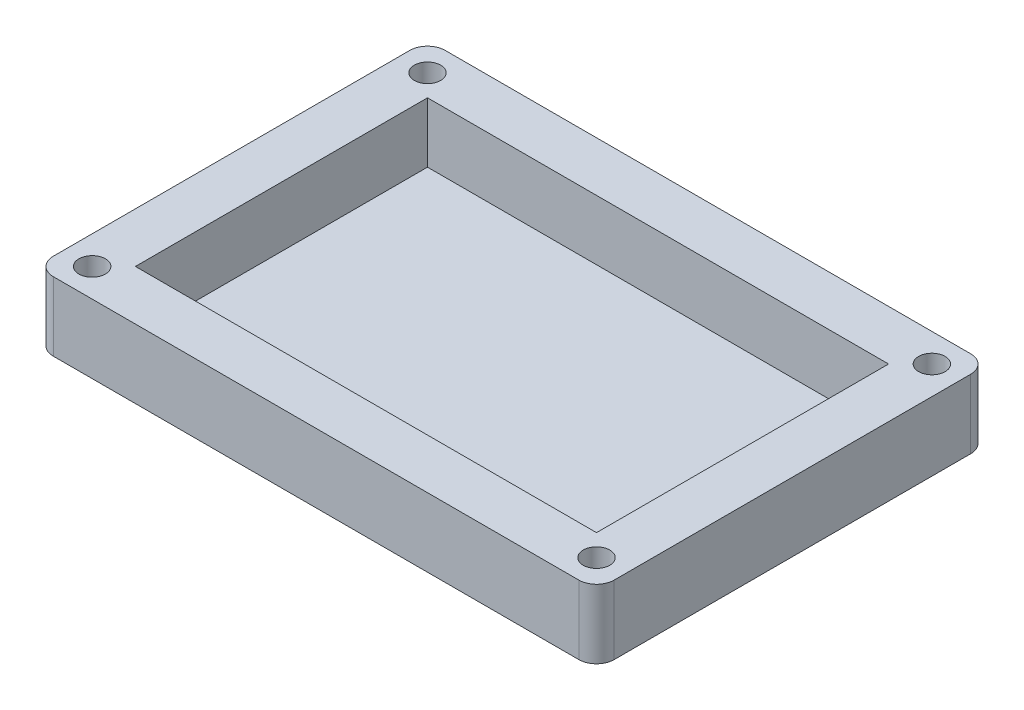
ISO-10303-21;
HEADER;
FILE_DESCRIPTION(('STEP AP214'),'2;1');
FILE_NAME('part.step','',(''),(''),'','','');
FILE_SCHEMA(('AUTOMOTIVE_DESIGN { 1 0 10303 214 1 1 1 1 }'));
ENDSEC;
DATA;
#1=APPLICATION_CONTEXT('core data for automotive mechanical design processes');
#2=APPLICATION_PROTOCOL_DEFINITION('international standard','automotive_design',2000,#1);
#3=PRODUCT_CONTEXT('',#1,'mechanical');
#4=PRODUCT('Part','Part','',(#3));
#5=PRODUCT_RELATED_PRODUCT_CATEGORY('part','',(#4));
#6=PRODUCT_DEFINITION_FORMATION('','',#4);
#7=PRODUCT_DEFINITION_CONTEXT('part definition',#1,'design');
#8=PRODUCT_DEFINITION('design','',#6,#7);
#9=PRODUCT_DEFINITION_SHAPE('','',#8);
#10=(LENGTH_UNIT() NAMED_UNIT(*) SI_UNIT(.MILLI.,.METRE.));
#11=(NAMED_UNIT(*) PLANE_ANGLE_UNIT() SI_UNIT($,.RADIAN.));
#12=(NAMED_UNIT(*) SI_UNIT($,.STERADIAN.) SOLID_ANGLE_UNIT());
#13=UNCERTAINTY_MEASURE_WITH_UNIT(LENGTH_MEASURE(1.E-05),#10,'distance_accuracy_value','');
#14=(GEOMETRIC_REPRESENTATION_CONTEXT(3) GLOBAL_UNCERTAINTY_ASSIGNED_CONTEXT((#13)) GLOBAL_UNIT_ASSIGNED_CONTEXT((#10,
#11,#12)) REPRESENTATION_CONTEXT('',''));
#15=CARTESIAN_POINT('',(0.,0.,0.));
#16=DIRECTION('',(0.,0.,1.));
#17=DIRECTION('',(1.,0.,0.));
#18=AXIS2_PLACEMENT_3D('',#15,#16,#17);
#19=CARTESIAN_POINT('',(0.,7.8,0.));
#20=DIRECTION('',(1.,0.,0.));
#21=DIRECTION('',(0.,0.,-1.));
#22=AXIS2_PLACEMENT_3D('',#19,#20,#21);
#23=PLANE('',#22);
#24=DIRECTION('',(0.,0.,1.));
#25=VECTOR('',#24,1.);
#26=CARTESIAN_POINT('',(0.,7.8,0.));
#27=LINE('',#26,#25);
#28=CARTESIAN_POINT('',(0.,7.8,-42.36533334));
#29=VERTEX_POINT('',#28);
#30=CARTESIAN_POINT('',(0.,7.8,-2.));
#31=VERTEX_POINT('',#30);
#32=EDGE_CURVE('E200',#29,#31,#27,.T.);
#33=ORIENTED_EDGE('',*,*,#32,.F.);
#34=DIRECTION('',(0.,-1.,0.));
#35=VECTOR('',#34,1.);
#36=CARTESIAN_POINT('',(0.,7.8,-42.36533334));
#37=LINE('',#36,#35);
#38=CARTESIAN_POINT('',(0.,0.,-42.36533334));
#39=VERTEX_POINT('',#38);
#40=EDGE_CURVE('E226',#29,#39,#37,.T.);
#41=ORIENTED_EDGE('',*,*,#40,.T.);
#42=DIRECTION('',(0.,0.,1.));
#43=VECTOR('',#42,1.);
#44=CARTESIAN_POINT('',(0.,0.,0.));
#45=LINE('',#44,#43);
#46=CARTESIAN_POINT('',(0.,0.,-2.));
#47=VERTEX_POINT('',#46);
#48=EDGE_CURVE('E192',#39,#47,#45,.T.);
#49=ORIENTED_EDGE('',*,*,#48,.T.);
#50=DIRECTION('',(0.,-1.,0.));
#51=VECTOR('',#50,1.);
#52=CARTESIAN_POINT('',(0.,7.8,-2.));
#53=LINE('',#52,#51);
#54=EDGE_CURVE('E215',#47,#31,#53,.F.);
#55=ORIENTED_EDGE('',*,*,#54,.T.);
#56=EDGE_LOOP('',(#33,#41,#49,#55));
#57=FACE_BOUND('',#56,.T.);
#58=ADVANCED_FACE('F50',(#57),#23,.F.);
#59=CARTESIAN_POINT('',(0.,7.8,0.));
#60=DIRECTION('',(0.,0.,-1.));
#61=DIRECTION('',(-1.,0.,0.));
#62=AXIS2_PLACEMENT_3D('',#59,#60,#61);
#63=PLANE('',#62);
#64=DIRECTION('',(1.,0.,0.));
#65=VECTOR('',#64,1.);
#66=CARTESIAN_POINT('',(0.,0.,0.));
#67=LINE('',#66,#65);
#68=CARTESIAN_POINT('',(2.,0.,0.));
#69=VERTEX_POINT('',#68);
#70=CARTESIAN_POINT('',(61.5,0.,0.));
#71=VERTEX_POINT('',#70);
#72=EDGE_CURVE('E216',#69,#71,#67,.T.);
#73=ORIENTED_EDGE('',*,*,#72,.T.);
#74=DIRECTION('',(0.,-1.,0.));
#75=VECTOR('',#74,1.);
#76=CARTESIAN_POINT('',(61.5,7.8,0.));
#77=LINE('',#76,#75);
#78=CARTESIAN_POINT('',(61.5,7.8,0.));
#79=VERTEX_POINT('',#78);
#80=EDGE_CURVE('E11',#71,#79,#77,.F.);
#81=ORIENTED_EDGE('',*,*,#80,.T.);
#82=DIRECTION('',(1.,0.,0.));
#83=VECTOR('',#82,1.);
#84=CARTESIAN_POINT('',(0.,7.8,0.));
#85=LINE('',#84,#83);
#86=CARTESIAN_POINT('',(2.,7.8,0.));
#87=VERTEX_POINT('',#86);
#88=EDGE_CURVE('E201',#87,#79,#85,.T.);
#89=ORIENTED_EDGE('',*,*,#88,.F.);
#90=DIRECTION('',(0.,-1.,0.));
#91=VECTOR('',#90,1.);
#92=CARTESIAN_POINT('',(2.,7.8,0.));
#93=LINE('',#92,#91);
#94=EDGE_CURVE('E57',#87,#69,#93,.T.);
#95=ORIENTED_EDGE('',*,*,#94,.T.);
#96=EDGE_LOOP('',(#73,#81,#89,#95));
#97=FACE_BOUND('',#96,.T.);
#98=ADVANCED_FACE('F271',(#97),#63,.F.);
#99=CARTESIAN_POINT('',(63.5,7.8,0.));
#100=DIRECTION('',(-1.,0.,0.));
#101=DIRECTION('',(0.,0.,1.));
#102=AXIS2_PLACEMENT_3D('',#99,#100,#101);
#103=PLANE('',#102);
#104=DIRECTION('',(0.,0.,-1.));
#105=VECTOR('',#104,1.);
#106=CARTESIAN_POINT('',(63.5,0.,0.));
#107=LINE('',#106,#105);
#108=CARTESIAN_POINT('',(63.5,0.,-2.));
#109=VERTEX_POINT('',#108);
#110=CARTESIAN_POINT('',(63.5,0.,-42.36533334));
#111=VERTEX_POINT('',#110);
#112=EDGE_CURVE('E219',#109,#111,#107,.T.);
#113=ORIENTED_EDGE('',*,*,#112,.T.);
#114=DIRECTION('',(0.,-1.,0.));
#115=VECTOR('',#114,1.);
#116=CARTESIAN_POINT('',(63.5,7.8,-42.36533334));
#117=LINE('',#116,#115);
#118=CARTESIAN_POINT('',(63.5,7.8,-42.36533334));
#119=VERTEX_POINT('',#118);
#120=EDGE_CURVE('E64',#111,#119,#117,.F.);
#121=ORIENTED_EDGE('',*,*,#120,.T.);
#122=DIRECTION('',(0.,0.,-1.));
#123=VECTOR('',#122,1.);
#124=CARTESIAN_POINT('',(63.5,7.8,0.));
#125=LINE('',#124,#123);
#126=CARTESIAN_POINT('',(63.5,7.8,-2.));
#127=VERTEX_POINT('',#126);
#128=EDGE_CURVE('E204',#127,#119,#125,.T.);
#129=ORIENTED_EDGE('',*,*,#128,.F.);
#130=DIRECTION('',(0.,-1.,0.));
#131=VECTOR('',#130,1.);
#132=CARTESIAN_POINT('',(63.5,7.8,-2.));
#133=LINE('',#132,#131);
#134=EDGE_CURVE('E265',#127,#109,#133,.T.);
#135=ORIENTED_EDGE('',*,*,#134,.T.);
#136=EDGE_LOOP('',(#113,#121,#129,#135));
#137=FACE_BOUND('',#136,.T.);
#138=ADVANCED_FACE('F282',(#137),#103,.F.);
#139=CARTESIAN_POINT('',(0.,7.8,-44.36533334));
#140=DIRECTION('',(0.,0.,1.));
#141=DIRECTION('',(1.,0.,0.));
#142=AXIS2_PLACEMENT_3D('',#139,#140,#141);
#143=PLANE('',#142);
#144=DIRECTION('',(-1.,0.,0.));
#145=VECTOR('',#144,1.);
#146=CARTESIAN_POINT('',(0.,0.,-44.36533334));
#147=LINE('',#146,#145);
#148=CARTESIAN_POINT('',(61.5,0.,-44.36533334));
#149=VERTEX_POINT('',#148);
#150=CARTESIAN_POINT('',(2.00000000000001,0.,-44.36533334));
#151=VERTEX_POINT('',#150);
#152=EDGE_CURVE('E205',#149,#151,#147,.T.);
#153=ORIENTED_EDGE('',*,*,#152,.T.);
#154=DIRECTION('',(0.,-1.,0.));
#155=VECTOR('',#154,1.);
#156=CARTESIAN_POINT('',(2.00000000000001,7.8,-44.36533334));
#157=LINE('',#156,#155);
#158=CARTESIAN_POINT('',(2.00000000000001,7.8,-44.36533334));
#159=VERTEX_POINT('',#158);
#160=EDGE_CURVE('E247',#151,#159,#157,.F.);
#161=ORIENTED_EDGE('',*,*,#160,.T.);
#162=DIRECTION('',(-1.,0.,0.));
#163=VECTOR('',#162,1.);
#164=CARTESIAN_POINT('',(0.,7.8,-44.36533334));
#165=LINE('',#164,#163);
#166=CARTESIAN_POINT('',(61.5,7.8,-44.36533334));
#167=VERTEX_POINT('',#166);
#168=EDGE_CURVE('E206',#167,#159,#165,.T.);
#169=ORIENTED_EDGE('',*,*,#168,.F.);
#170=DIRECTION('',(0.,-1.,0.));
#171=VECTOR('',#170,1.);
#172=CARTESIAN_POINT('',(61.5,7.8,-44.36533334));
#173=LINE('',#172,#171);
#174=EDGE_CURVE('E242',#167,#149,#173,.T.);
#175=ORIENTED_EDGE('',*,*,#174,.T.);
#176=EDGE_LOOP('',(#153,#161,#169,#175));
#177=FACE_BOUND('',#176,.T.);
#178=ADVANCED_FACE('F291',(#177),#143,.F.);
#179=CARTESIAN_POINT('',(0.,7.8,0.));
#180=DIRECTION('',(0.,-1.,0.));
#181=DIRECTION('',(0.,0.,-1.));
#182=AXIS2_PLACEMENT_3D('',#179,#180,#181);
#183=PLANE('',#182);
#184=CARTESIAN_POINT('',(60.3,7.8,-3.2));
#185=DIRECTION('',(0.,1.,0.));
#186=DIRECTION('',(0.,0.,1.));
#187=AXIS2_PLACEMENT_3D('',#184,#185,#186);
#188=CIRCLE('',#187,1.50000000956303);
#189=CARTESIAN_POINT('',(60.3,7.8,-1.69999999043697));
#190=VERTEX_POINT('',#189);
#191=EDGE_CURVE('E492',#190,#190,#188,.T.);
#192=ORIENTED_EDGE('',*,*,#191,.F.);
#193=EDGE_LOOP('',(#192));
#194=FACE_BOUND('',#193,.T.);
#195=CARTESIAN_POINT('',(60.3,7.8,-41.16533334));
#196=DIRECTION('',(0.,1.,0.));
#197=DIRECTION('',(0.,0.,1.));
#198=AXIS2_PLACEMENT_3D('',#195,#196,#197);
#199=CIRCLE('',#198,1.50000000956304);
#200=CARTESIAN_POINT('',(60.3,7.8,-39.665333330437));
#201=VERTEX_POINT('',#200);
#202=EDGE_CURVE('E497',#201,#201,#199,.T.);
#203=ORIENTED_EDGE('',*,*,#202,.F.);
#204=EDGE_LOOP('',(#203));
#205=FACE_BOUND('',#204,.T.);
#206=CARTESIAN_POINT('',(3.20000000000001,7.8,-41.16533334));
#207=DIRECTION('',(0.,1.,0.));
#208=DIRECTION('',(0.,0.,1.));
#209=AXIS2_PLACEMENT_3D('',#206,#207,#208);
#210=CIRCLE('',#209,1.5);
#211=CARTESIAN_POINT('',(3.20000000000001,7.8,-39.66533334));
#212=VERTEX_POINT('',#211);
#213=EDGE_CURVE('E503',#212,#212,#210,.T.);
#214=ORIENTED_EDGE('',*,*,#213,.F.);
#215=EDGE_LOOP('',(#214));
#216=FACE_BOUND('',#215,.T.);
#217=CARTESIAN_POINT('',(3.2,7.8,-3.2));
#218=DIRECTION('',(0.,1.,0.));
#219=DIRECTION('',(0.,0.,1.));
#220=AXIS2_PLACEMENT_3D('',#217,#218,#219);
#221=CIRCLE('',#220,1.5);
#222=CARTESIAN_POINT('',(3.2,7.8,-1.7));
#223=VERTEX_POINT('',#222);
#224=EDGE_CURVE('E175',#223,#223,#221,.T.);
#225=ORIENTED_EDGE('',*,*,#224,.F.);
#226=EDGE_LOOP('',(#225));
#227=FACE_BOUND('',#226,.T.);
#228=DIRECTION('',(1.,0.,0.));
#229=VECTOR('',#228,1.);
#230=CARTESIAN_POINT('',(5.65,7.8,-5.65));
#231=LINE('',#230,#229);
#232=CARTESIAN_POINT('',(5.65,7.8,-5.65));
#233=VERTEX_POINT('',#232);
#234=CARTESIAN_POINT('',(57.85000001,7.8,-5.65));
#235=VERTEX_POINT('',#234);
#236=EDGE_CURVE('E181',#233,#235,#231,.T.);
#237=ORIENTED_EDGE('',*,*,#236,.F.);
#238=DIRECTION('',(0.,0.,1.));
#239=VECTOR('',#238,1.);
#240=CARTESIAN_POINT('',(5.65,7.8,-5.65));
#241=LINE('',#240,#239);
#242=CARTESIAN_POINT('',(5.65000000000001,7.8,-38.71533334));
#243=VERTEX_POINT('',#242);
#244=EDGE_CURVE('E143',#243,#233,#241,.T.);
#245=ORIENTED_EDGE('',*,*,#244,.F.);
#246=DIRECTION('',(-1.,0.,0.));
#247=VECTOR('',#246,1.);
#248=CARTESIAN_POINT('',(5.65000000000001,7.8,-38.71533334));
#249=LINE('',#248,#247);
#250=CARTESIAN_POINT('',(57.85000001,7.8,-38.71533334));
#251=VERTEX_POINT('',#250);
#252=EDGE_CURVE('E164',#251,#243,#249,.T.);
#253=ORIENTED_EDGE('',*,*,#252,.F.);
#254=DIRECTION('',(0.,0.,-1.));
#255=VECTOR('',#254,1.);
#256=CARTESIAN_POINT('',(57.85000001,7.8,-5.65));
#257=LINE('',#256,#255);
#258=EDGE_CURVE('E169',#235,#251,#257,.T.);
#259=ORIENTED_EDGE('',*,*,#258,.F.);
#260=EDGE_LOOP('',(#237,#245,#253,#259));
#261=FACE_BOUND('',#260,.T.);
#262=ORIENTED_EDGE('',*,*,#168,.T.);
#263=CARTESIAN_POINT('',(2.00000000000001,7.8,-42.36533334));
#264=DIRECTION('',(0.,-1.,0.));
#265=DIRECTION('',(0.,0.,-1.));
#266=AXIS2_PLACEMENT_3D('',#263,#264,#265);
#267=CIRCLE('',#266,2.);
#268=EDGE_CURVE('E256',#159,#29,#267,.F.);
#269=ORIENTED_EDGE('',*,*,#268,.T.);
#270=ORIENTED_EDGE('',*,*,#32,.T.);
#271=CARTESIAN_POINT('',(2.,7.8,-2.));
#272=DIRECTION('',(0.,-1.,0.));
#273=DIRECTION('',(0.,0.,-1.));
#274=AXIS2_PLACEMENT_3D('',#271,#272,#273);
#275=CIRCLE('',#274,2.);
#276=EDGE_CURVE('E252',#31,#87,#275,.F.);
#277=ORIENTED_EDGE('',*,*,#276,.T.);
#278=ORIENTED_EDGE('',*,*,#88,.T.);
#279=CARTESIAN_POINT('',(61.5,7.8,-2.));
#280=DIRECTION('',(0.,-1.,0.));
#281=DIRECTION('',(0.,0.,-1.));
#282=AXIS2_PLACEMENT_3D('',#279,#280,#281);
#283=CIRCLE('',#282,2.);
#284=EDGE_CURVE('E69',#79,#127,#283,.F.);
#285=ORIENTED_EDGE('',*,*,#284,.T.);
#286=ORIENTED_EDGE('',*,*,#128,.T.);
#287=CARTESIAN_POINT('',(61.5,7.8,-42.36533334));
#288=DIRECTION('',(0.,-1.,0.));
#289=DIRECTION('',(0.,0.,-1.));
#290=AXIS2_PLACEMENT_3D('',#287,#288,#289);
#291=CIRCLE('',#290,2.);
#292=EDGE_CURVE('E257',#119,#167,#291,.F.);
#293=ORIENTED_EDGE('',*,*,#292,.T.);
#294=EDGE_LOOP('',(#262,#269,#270,#277,#278,#285,#286,#293));
#295=FACE_BOUND('',#294,.T.);
#296=ADVANCED_FACE('F286',(#194,#205,#216,#227,#261,#295),#183,.F.);
#297=CARTESIAN_POINT('',(0.,0.,0.));
#298=DIRECTION('',(0.,-1.,0.));
#299=DIRECTION('',(0.,0.,-1.));
#300=AXIS2_PLACEMENT_3D('',#297,#298,#299);
#301=PLANE('',#300);
#302=ORIENTED_EDGE('',*,*,#48,.F.);
#303=CARTESIAN_POINT('',(2.00000000000001,0.,-42.36533334));
#304=DIRECTION('',(0.,-1.,0.));
#305=DIRECTION('',(0.,0.,-1.));
#306=AXIS2_PLACEMENT_3D('',#303,#304,#305);
#307=CIRCLE('',#306,2.);
#308=EDGE_CURVE('E241',#39,#151,#307,.T.);
#309=ORIENTED_EDGE('',*,*,#308,.T.);
#310=ORIENTED_EDGE('',*,*,#152,.F.);
#311=CARTESIAN_POINT('',(61.5,0.,-42.36533334));
#312=DIRECTION('',(0.,-1.,0.));
#313=DIRECTION('',(0.,0.,-1.));
#314=AXIS2_PLACEMENT_3D('',#311,#312,#313);
#315=CIRCLE('',#314,2.);
#316=EDGE_CURVE('E238',#149,#111,#315,.T.);
#317=ORIENTED_EDGE('',*,*,#316,.T.);
#318=ORIENTED_EDGE('',*,*,#112,.F.);
#319=CARTESIAN_POINT('',(61.5,0.,-2.));
#320=DIRECTION('',(0.,-1.,0.));
#321=DIRECTION('',(0.,0.,-1.));
#322=AXIS2_PLACEMENT_3D('',#319,#320,#321);
#323=CIRCLE('',#322,2.);
#324=EDGE_CURVE('E232',#109,#71,#323,.T.);
#325=ORIENTED_EDGE('',*,*,#324,.T.);
#326=ORIENTED_EDGE('',*,*,#72,.F.);
#327=CARTESIAN_POINT('',(2.,0.,-2.));
#328=DIRECTION('',(0.,-1.,0.));
#329=DIRECTION('',(0.,0.,-1.));
#330=AXIS2_PLACEMENT_3D('',#327,#328,#329);
#331=CIRCLE('',#330,2.);
#332=EDGE_CURVE('E235',#69,#47,#331,.T.);
#333=ORIENTED_EDGE('',*,*,#332,.T.);
#334=EDGE_LOOP('',(#302,#309,#310,#317,#318,#325,#326,#333));
#335=FACE_BOUND('',#334,.T.);
#336=ADVANCED_FACE('F276',(#335),#301,.T.);
#337=CARTESIAN_POINT('',(5.65,1.,-5.65));
#338=DIRECTION('',(-1.,0.,0.));
#339=DIRECTION('',(0.,0.,1.));
#340=AXIS2_PLACEMENT_3D('',#337,#338,#339);
#341=PLANE('',#340);
#342=ORIENTED_EDGE('',*,*,#244,.T.);
#343=DIRECTION('',(0.,1.,0.));
#344=VECTOR('',#343,1.);
#345=CARTESIAN_POINT('',(5.65,1.,-5.65));
#346=LINE('',#345,#344);
#347=CARTESIAN_POINT('',(5.65,1.,-5.65));
#348=VERTEX_POINT('',#347);
#349=EDGE_CURVE('E137',#348,#233,#346,.T.);
#350=ORIENTED_EDGE('',*,*,#349,.F.);
#351=DIRECTION('',(0.,0.,1.));
#352=VECTOR('',#351,1.);
#353=CARTESIAN_POINT('',(5.65,1.,-5.65));
#354=LINE('',#353,#352);
#355=CARTESIAN_POINT('',(5.65000000000001,1.,-38.71533334));
#356=VERTEX_POINT('',#355);
#357=EDGE_CURVE('E145',#356,#348,#354,.T.);
#358=ORIENTED_EDGE('',*,*,#357,.F.);
#359=DIRECTION('',(0.,1.,0.));
#360=VECTOR('',#359,1.);
#361=CARTESIAN_POINT('',(5.65000000000001,1.,-38.71533334));
#362=LINE('',#361,#360);
#363=EDGE_CURVE('E189',#356,#243,#362,.T.);
#364=ORIENTED_EDGE('',*,*,#363,.T.);
#365=EDGE_LOOP('',(#342,#350,#358,#364));
#366=FACE_BOUND('',#365,.T.);
#367=ADVANCED_FACE('F139',(#366),#341,.F.);
#368=CARTESIAN_POINT('',(5.65000000000001,1.,-38.71533334));
#369=DIRECTION('',(0.,0.,-1.));
#370=DIRECTION('',(-1.,0.,0.));
#371=AXIS2_PLACEMENT_3D('',#368,#369,#370);
#372=PLANE('',#371);
#373=ORIENTED_EDGE('',*,*,#252,.T.);
#374=ORIENTED_EDGE('',*,*,#363,.F.);
#375=DIRECTION('',(-1.,0.,0.));
#376=VECTOR('',#375,1.);
#377=CARTESIAN_POINT('',(5.65000000000001,1.,-38.71533334));
#378=LINE('',#377,#376);
#379=CARTESIAN_POINT('',(57.85000001,1.,-38.71533334));
#380=VERTEX_POINT('',#379);
#381=EDGE_CURVE('E151',#380,#356,#378,.T.);
#382=ORIENTED_EDGE('',*,*,#381,.F.);
#383=DIRECTION('',(0.,1.,0.));
#384=VECTOR('',#383,1.);
#385=CARTESIAN_POINT('',(57.85000001,1.,-38.71533334));
#386=LINE('',#385,#384);
#387=EDGE_CURVE('E195',#380,#251,#386,.T.);
#388=ORIENTED_EDGE('',*,*,#387,.T.);
#389=EDGE_LOOP('',(#373,#374,#382,#388));
#390=FACE_BOUND('',#389,.T.);
#391=ADVANCED_FACE('F435',(#390),#372,.F.);
#392=CARTESIAN_POINT('',(57.85000001,1.,-5.65));
#393=DIRECTION('',(1.,0.,0.));
#394=DIRECTION('',(0.,0.,-1.));
#395=AXIS2_PLACEMENT_3D('',#392,#393,#394);
#396=PLANE('',#395);
#397=ORIENTED_EDGE('',*,*,#258,.T.);
#398=ORIENTED_EDGE('',*,*,#387,.F.);
#399=DIRECTION('',(0.,0.,-1.));
#400=VECTOR('',#399,1.);
#401=CARTESIAN_POINT('',(57.85000001,1.,-5.65));
#402=LINE('',#401,#400);
#403=CARTESIAN_POINT('',(57.85000001,1.,-5.65));
#404=VERTEX_POINT('',#403);
#405=EDGE_CURVE('E159',#404,#380,#402,.T.);
#406=ORIENTED_EDGE('',*,*,#405,.F.);
#407=DIRECTION('',(0.,1.,0.));
#408=VECTOR('',#407,1.);
#409=CARTESIAN_POINT('',(57.85000001,1.,-5.65));
#410=LINE('',#409,#408);
#411=EDGE_CURVE('E148',#404,#235,#410,.T.);
#412=ORIENTED_EDGE('',*,*,#411,.T.);
#413=EDGE_LOOP('',(#397,#398,#406,#412));
#414=FACE_BOUND('',#413,.T.);
#415=ADVANCED_FACE('F425',(#414),#396,.F.);
#416=CARTESIAN_POINT('',(5.65,1.,-5.65));
#417=DIRECTION('',(0.,0.,1.));
#418=DIRECTION('',(1.,0.,0.));
#419=AXIS2_PLACEMENT_3D('',#416,#417,#418);
#420=PLANE('',#419);
#421=ORIENTED_EDGE('',*,*,#236,.T.);
#422=ORIENTED_EDGE('',*,*,#411,.F.);
#423=DIRECTION('',(1.,0.,0.));
#424=VECTOR('',#423,1.);
#425=CARTESIAN_POINT('',(5.65,1.,-5.65));
#426=LINE('',#425,#424);
#427=EDGE_CURVE('E152',#348,#404,#426,.T.);
#428=ORIENTED_EDGE('',*,*,#427,.F.);
#429=ORIENTED_EDGE('',*,*,#349,.T.);
#430=EDGE_LOOP('',(#421,#422,#428,#429));
#431=FACE_BOUND('',#430,.T.);
#432=ADVANCED_FACE('F154',(#431),#420,.F.);
#433=CARTESIAN_POINT('',(0.,1.,0.));
#434=DIRECTION('',(0.,-1.,0.));
#435=DIRECTION('',(0.,0.,-1.));
#436=AXIS2_PLACEMENT_3D('',#433,#434,#435);
#437=PLANE('',#436);
#438=ORIENTED_EDGE('',*,*,#357,.T.);
#439=ORIENTED_EDGE('',*,*,#427,.T.);
#440=ORIENTED_EDGE('',*,*,#405,.T.);
#441=ORIENTED_EDGE('',*,*,#381,.T.);
#442=EDGE_LOOP('',(#438,#439,#440,#441));
#443=FACE_BOUND('',#442,.T.);
#444=ADVANCED_FACE('F162',(#443),#437,.F.);
#445=CARTESIAN_POINT('',(3.2,0.3,-3.2));
#446=DIRECTION('',(0.,1.,0.));
#447=DIRECTION('',(0.,0.,1.));
#448=AXIS2_PLACEMENT_3D('',#445,#446,#447);
#449=CYLINDRICAL_SURFACE('',#448,1.5);
#450=CARTESIAN_POINT('',(3.2,0.3,-3.2));
#451=DIRECTION('',(0.,1.,0.));
#452=DIRECTION('',(0.,0.,1.));
#453=AXIS2_PLACEMENT_3D('',#450,#451,#452);
#454=CIRCLE('',#453,1.5);
#455=CARTESIAN_POINT('',(3.2,0.3,-1.7));
#456=VERTEX_POINT('',#455);
#457=EDGE_CURVE('E185',#456,#456,#454,.T.);
#458=ORIENTED_EDGE('',*,*,#457,.F.);
#459=EDGE_LOOP('',(#458));
#460=FACE_BOUND('',#459,.T.);
#461=ORIENTED_EDGE('',*,*,#224,.T.);
#462=EDGE_LOOP('',(#461));
#463=FACE_BOUND('',#462,.T.);
#464=ADVANCED_FACE('F399',(#460,#463),#449,.F.);
#465=CARTESIAN_POINT('',(3.2,0.3,-3.2));
#466=DIRECTION('',(0.,1.,0.));
#467=DIRECTION('',(0.,0.,1.));
#468=AXIS2_PLACEMENT_3D('',#465,#466,#467);
#469=PLANE('',#468);
#470=ORIENTED_EDGE('',*,*,#457,.T.);
#471=EDGE_LOOP('',(#470));
#472=FACE_BOUND('',#471,.T.);
#473=ADVANCED_FACE('F391',(#472),#469,.T.);
#474=CARTESIAN_POINT('',(3.20000000000001,0.3,-41.16533334));
#475=DIRECTION('',(0.,1.,0.));
#476=DIRECTION('',(0.,0.,1.));
#477=AXIS2_PLACEMENT_3D('',#474,#475,#476);
#478=CYLINDRICAL_SURFACE('',#477,1.5);
#479=CARTESIAN_POINT('',(3.20000000000001,0.3,-41.16533334));
#480=DIRECTION('',(0.,1.,0.));
#481=DIRECTION('',(0.,0.,1.));
#482=AXIS2_PLACEMENT_3D('',#479,#480,#481);
#483=CIRCLE('',#482,1.5);
#484=CARTESIAN_POINT('',(3.20000000000001,0.3,-39.66533334));
#485=VERTEX_POINT('',#484);
#486=EDGE_CURVE('E511',#485,#485,#483,.T.);
#487=ORIENTED_EDGE('',*,*,#486,.F.);
#488=EDGE_LOOP('',(#487));
#489=FACE_BOUND('',#488,.T.);
#490=ORIENTED_EDGE('',*,*,#213,.T.);
#491=EDGE_LOOP('',(#490));
#492=FACE_BOUND('',#491,.T.);
#493=ADVANCED_FACE('F385',(#489,#492),#478,.F.);
#494=CARTESIAN_POINT('',(3.20000000000001,0.3,-41.16533334));
#495=DIRECTION('',(0.,1.,0.));
#496=DIRECTION('',(0.,0.,1.));
#497=AXIS2_PLACEMENT_3D('',#494,#495,#496);
#498=PLANE('',#497);
#499=ORIENTED_EDGE('',*,*,#486,.T.);
#500=EDGE_LOOP('',(#499));
#501=FACE_BOUND('',#500,.T.);
#502=ADVANCED_FACE('F373',(#501),#498,.T.);
#503=CARTESIAN_POINT('',(60.3,0.3,-41.16533334));
#504=DIRECTION('',(0.,1.,0.));
#505=DIRECTION('',(0.,0.,1.));
#506=AXIS2_PLACEMENT_3D('',#503,#504,#505);
#507=CYLINDRICAL_SURFACE('',#506,1.50000000956304);
#508=CARTESIAN_POINT('',(60.3,0.3,-41.16533334));
#509=DIRECTION('',(0.,1.,0.));
#510=DIRECTION('',(0.,0.,1.));
#511=AXIS2_PLACEMENT_3D('',#508,#509,#510);
#512=CIRCLE('',#511,1.50000000956304);
#513=CARTESIAN_POINT('',(60.3,0.3,-39.665333330437));
#514=VERTEX_POINT('',#513);
#515=EDGE_CURVE('E523',#514,#514,#512,.T.);
#516=ORIENTED_EDGE('',*,*,#515,.F.);
#517=EDGE_LOOP('',(#516));
#518=FACE_BOUND('',#517,.T.);
#519=ORIENTED_EDGE('',*,*,#202,.T.);
#520=EDGE_LOOP('',(#519));
#521=FACE_BOUND('',#520,.T.);
#522=ADVANCED_FACE('F364',(#518,#521),#507,.F.);
#523=CARTESIAN_POINT('',(60.3,0.3,-41.16533334));
#524=DIRECTION('',(0.,1.,0.));
#525=DIRECTION('',(0.,0.,1.));
#526=AXIS2_PLACEMENT_3D('',#523,#524,#525);
#527=PLANE('',#526);
#528=ORIENTED_EDGE('',*,*,#515,.T.);
#529=EDGE_LOOP('',(#528));
#530=FACE_BOUND('',#529,.T.);
#531=ADVANCED_FACE('F354',(#530),#527,.T.);
#532=CARTESIAN_POINT('',(60.3,0.3,-3.2));
#533=DIRECTION('',(0.,1.,0.));
#534=DIRECTION('',(0.,0.,1.));
#535=AXIS2_PLACEMENT_3D('',#532,#533,#534);
#536=CYLINDRICAL_SURFACE('',#535,1.50000000956303);
#537=CARTESIAN_POINT('',(60.3,0.3,-3.2));
#538=DIRECTION('',(0.,1.,0.));
#539=DIRECTION('',(0.,0.,1.));
#540=AXIS2_PLACEMENT_3D('',#537,#538,#539);
#541=CIRCLE('',#540,1.50000000956303);
#542=CARTESIAN_POINT('',(60.3,0.3,-1.69999999043697));
#543=VERTEX_POINT('',#542);
#544=EDGE_CURVE('E528',#543,#543,#541,.T.);
#545=ORIENTED_EDGE('',*,*,#544,.F.);
#546=EDGE_LOOP('',(#545));
#547=FACE_BOUND('',#546,.T.);
#548=ORIENTED_EDGE('',*,*,#191,.T.);
#549=EDGE_LOOP('',(#548));
#550=FACE_BOUND('',#549,.T.);
#551=ADVANCED_FACE('F346',(#547,#550),#536,.F.);
#552=CARTESIAN_POINT('',(60.3,0.3,-3.2));
#553=DIRECTION('',(0.,1.,0.));
#554=DIRECTION('',(0.,0.,1.));
#555=AXIS2_PLACEMENT_3D('',#552,#553,#554);
#556=PLANE('',#555);
#557=ORIENTED_EDGE('',*,*,#544,.T.);
#558=EDGE_LOOP('',(#557));
#559=FACE_BOUND('',#558,.T.);
#560=ADVANCED_FACE('F320',(#559),#556,.T.);
#561=CARTESIAN_POINT('',(2.00000000000001,7.8,-42.36533334));
#562=DIRECTION('',(0.,-1.,0.));
#563=DIRECTION('',(0.,0.,-1.));
#564=AXIS2_PLACEMENT_3D('',#561,#562,#563);
#565=CYLINDRICAL_SURFACE('',#564,2.);
#566=ORIENTED_EDGE('',*,*,#268,.F.);
#567=ORIENTED_EDGE('',*,*,#160,.F.);
#568=ORIENTED_EDGE('',*,*,#308,.F.);
#569=ORIENTED_EDGE('',*,*,#40,.F.);
#570=EDGE_LOOP('',(#566,#567,#568,#569));
#571=FACE_BOUND('',#570,.T.);
#572=ADVANCED_FACE('F296',(#571),#565,.T.);
#573=CARTESIAN_POINT('',(61.5,7.8,-42.36533334));
#574=DIRECTION('',(0.,-1.,0.));
#575=DIRECTION('',(0.,0.,-1.));
#576=AXIS2_PLACEMENT_3D('',#573,#574,#575);
#577=CYLINDRICAL_SURFACE('',#576,2.);
#578=ORIENTED_EDGE('',*,*,#292,.F.);
#579=ORIENTED_EDGE('',*,*,#120,.F.);
#580=ORIENTED_EDGE('',*,*,#316,.F.);
#581=ORIENTED_EDGE('',*,*,#174,.F.);
#582=EDGE_LOOP('',(#578,#579,#580,#581));
#583=FACE_BOUND('',#582,.T.);
#584=ADVANCED_FACE('F289',(#583),#577,.T.);
#585=CARTESIAN_POINT('',(61.5,7.8,-2.));
#586=DIRECTION('',(0.,-1.,0.));
#587=DIRECTION('',(0.,0.,-1.));
#588=AXIS2_PLACEMENT_3D('',#585,#586,#587);
#589=CYLINDRICAL_SURFACE('',#588,2.);
#590=ORIENTED_EDGE('',*,*,#284,.F.);
#591=ORIENTED_EDGE('',*,*,#80,.F.);
#592=ORIENTED_EDGE('',*,*,#324,.F.);
#593=ORIENTED_EDGE('',*,*,#134,.F.);
#594=EDGE_LOOP('',(#590,#591,#592,#593));
#595=FACE_BOUND('',#594,.T.);
#596=ADVANCED_FACE('F283',(#595),#589,.T.);
#597=CARTESIAN_POINT('',(2.,7.8,-2.));
#598=DIRECTION('',(0.,-1.,0.));
#599=DIRECTION('',(0.,0.,-1.));
#600=AXIS2_PLACEMENT_3D('',#597,#598,#599);
#601=CYLINDRICAL_SURFACE('',#600,2.);
#602=ORIENTED_EDGE('',*,*,#276,.F.);
#603=ORIENTED_EDGE('',*,*,#54,.F.);
#604=ORIENTED_EDGE('',*,*,#332,.F.);
#605=ORIENTED_EDGE('',*,*,#94,.F.);
#606=EDGE_LOOP('',(#602,#603,#604,#605));
#607=FACE_BOUND('',#606,.T.);
#608=ADVANCED_FACE('F47',(#607),#601,.T.);
#609=CLOSED_SHELL('',(#58,#98,#138,#178,#296,#336,#367,#391,#415,#432,#444,#464,#473,#493,#502,
#522,#531,#551,#560,#572,#584,#596,#608));
#610=MANIFOLD_SOLID_BREP('B2',#609);
#611=ADVANCED_BREP_SHAPE_REPRESENTATION('',(#18,#610),#14);
#612=SHAPE_DEFINITION_REPRESENTATION(#9,#611);
ENDSEC;
END-ISO-10303-21;
